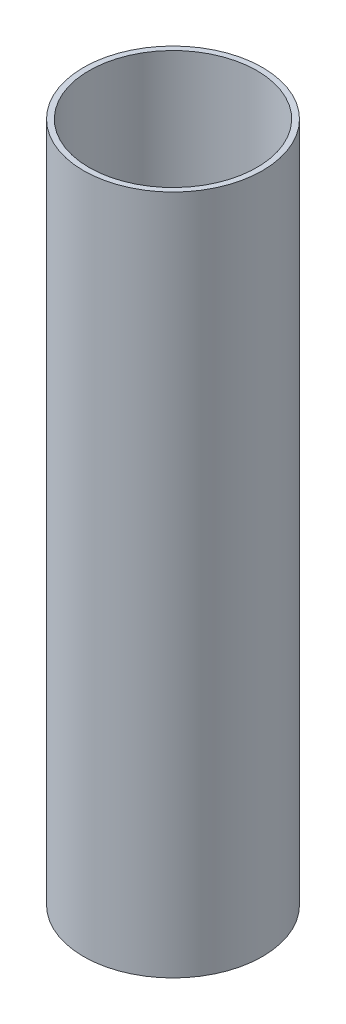
ISO-10303-21;
HEADER;
FILE_DESCRIPTION(('STEP AP214'),'2;1');
FILE_NAME('part.step','',(''),(''),'','','');
FILE_SCHEMA(('AUTOMOTIVE_DESIGN { 1 0 10303 214 1 1 1 1 }'));
ENDSEC;
DATA;
#1=APPLICATION_CONTEXT('core data for automotive mechanical design processes');
#2=APPLICATION_PROTOCOL_DEFINITION('international standard','automotive_design',2000,#1);
#3=PRODUCT_CONTEXT('',#1,'mechanical');
#4=PRODUCT('Part','Part','',(#3));
#5=PRODUCT_RELATED_PRODUCT_CATEGORY('part','',(#4));
#6=PRODUCT_DEFINITION_FORMATION('','',#4);
#7=PRODUCT_DEFINITION_CONTEXT('part definition',#1,'design');
#8=PRODUCT_DEFINITION('design','',#6,#7);
#9=PRODUCT_DEFINITION_SHAPE('','',#8);
#10=(LENGTH_UNIT() NAMED_UNIT(*) SI_UNIT(.MILLI.,.METRE.));
#11=(NAMED_UNIT(*) PLANE_ANGLE_UNIT() SI_UNIT($,.RADIAN.));
#12=(NAMED_UNIT(*) SI_UNIT($,.STERADIAN.) SOLID_ANGLE_UNIT());
#13=UNCERTAINTY_MEASURE_WITH_UNIT(LENGTH_MEASURE(1.E-05),#10,'distance_accuracy_value','');
#14=(GEOMETRIC_REPRESENTATION_CONTEXT(3) GLOBAL_UNCERTAINTY_ASSIGNED_CONTEXT((#13)) GLOBAL_UNIT_ASSIGNED_CONTEXT((#10,
#11,#12)) REPRESENTATION_CONTEXT('',''));
#15=CARTESIAN_POINT('',(0.,0.,0.));
#16=DIRECTION('',(0.,0.,1.));
#17=DIRECTION('',(1.,0.,0.));
#18=AXIS2_PLACEMENT_3D('',#15,#16,#17);
#19=CARTESIAN_POINT('',(0.,-70.,0.));
#20=DIRECTION('',(0.,1.,0.));
#21=DIRECTION('',(0.,0.,1.));
#22=AXIS2_PLACEMENT_3D('',#19,#20,#21);
#23=PLANE('',#22);
#24=CARTESIAN_POINT('',(0.,-70.,0.));
#25=DIRECTION('',(0.,1.,0.));
#26=DIRECTION('',(0.,0.,1.));
#27=AXIS2_PLACEMENT_3D('',#24,#25,#26);
#28=CIRCLE('',#27,8.63223788738674);
#29=CARTESIAN_POINT('',(0.,-70.,8.63223788738674));
#30=VERTEX_POINT('',#29);
#31=EDGE_CURVE('E61',#30,#30,#28,.T.);
#32=ORIENTED_EDGE('',*,*,#31,.T.);
#33=EDGE_LOOP('',(#32));
#34=FACE_BOUND('',#33,.T.);
#35=CARTESIAN_POINT('',(0.,-70.,0.));
#36=DIRECTION('',(0.,1.,0.));
#37=DIRECTION('',(0.,0.,1.));
#38=AXIS2_PLACEMENT_3D('',#35,#36,#37);
#39=CIRCLE('',#38,9.2);
#40=CARTESIAN_POINT('',(0.,-70.,9.19999999999998));
#41=VERTEX_POINT('',#40);
#42=EDGE_CURVE('E10',#41,#41,#39,.T.);
#43=ORIENTED_EDGE('',*,*,#42,.F.);
#44=EDGE_LOOP('',(#43));
#45=FACE_BOUND('',#44,.T.);
#46=ADVANCED_FACE('F47',(#34,#45),#23,.F.);
#47=CARTESIAN_POINT('',(0.,0.,0.));
#48=DIRECTION('',(0.,1.,0.));
#49=DIRECTION('',(0.,0.,1.));
#50=AXIS2_PLACEMENT_3D('',#47,#48,#49);
#51=CYLINDRICAL_SURFACE('',#50,9.2);
#52=CARTESIAN_POINT('',(0.,0.,0.));
#53=DIRECTION('',(0.,1.,0.));
#54=DIRECTION('',(0.,0.,1.));
#55=AXIS2_PLACEMENT_3D('',#52,#53,#54);
#56=CIRCLE('',#55,9.2);
#57=CARTESIAN_POINT('',(0.,0.,9.2));
#58=VERTEX_POINT('',#57);
#59=EDGE_CURVE('E54',#58,#58,#56,.T.);
#60=ORIENTED_EDGE('',*,*,#59,.F.);
#61=EDGE_LOOP('',(#60));
#62=FACE_BOUND('',#61,.T.);
#63=ORIENTED_EDGE('',*,*,#42,.T.);
#64=EDGE_LOOP('',(#63));
#65=FACE_BOUND('',#64,.T.);
#66=ADVANCED_FACE('F78',(#62,#65),#51,.T.);
#67=CARTESIAN_POINT('',(0.,0.,0.));
#68=DIRECTION('',(0.,-1.,0.));
#69=DIRECTION('',(0.,0.,-1.));
#70=AXIS2_PLACEMENT_3D('',#67,#68,#69);
#71=PLANE('',#70);
#72=CARTESIAN_POINT('',(0.,0.,0.));
#73=DIRECTION('',(0.,1.,0.));
#74=DIRECTION('',(0.,0.,1.));
#75=AXIS2_PLACEMENT_3D('',#72,#73,#74);
#76=CIRCLE('',#75,8.63223788738674);
#77=CARTESIAN_POINT('',(0.,0.,8.63223788738674));
#78=VERTEX_POINT('',#77);
#79=EDGE_CURVE('E67',#78,#78,#76,.T.);
#80=ORIENTED_EDGE('',*,*,#79,.F.);
#81=EDGE_LOOP('',(#80));
#82=FACE_BOUND('',#81,.T.);
#83=ORIENTED_EDGE('',*,*,#59,.T.);
#84=EDGE_LOOP('',(#83));
#85=FACE_BOUND('',#84,.T.);
#86=ADVANCED_FACE('F76',(#82,#85),#71,.F.);
#87=CARTESIAN_POINT('',(0.,-70.,0.));
#88=DIRECTION('',(0.,1.,0.));
#89=DIRECTION('',(0.,0.,1.));
#90=AXIS2_PLACEMENT_3D('',#87,#88,#89);
#91=CYLINDRICAL_SURFACE('',#90,8.63223788738674);
#92=ORIENTED_EDGE('',*,*,#31,.F.);
#93=EDGE_LOOP('',(#92));
#94=FACE_BOUND('',#93,.T.);
#95=ORIENTED_EDGE('',*,*,#79,.T.);
#96=EDGE_LOOP('',(#95));
#97=FACE_BOUND('',#96,.T.);
#98=ADVANCED_FACE('F74',(#94,#97),#91,.F.);
#99=CLOSED_SHELL('',(#46,#66,#86,#98));
#100=MANIFOLD_SOLID_BREP('B2',#99);
#101=ADVANCED_BREP_SHAPE_REPRESENTATION('',(#18,#100),#14);
#102=SHAPE_DEFINITION_REPRESENTATION(#9,#101);
ENDSEC;
END-ISO-10303-21;
